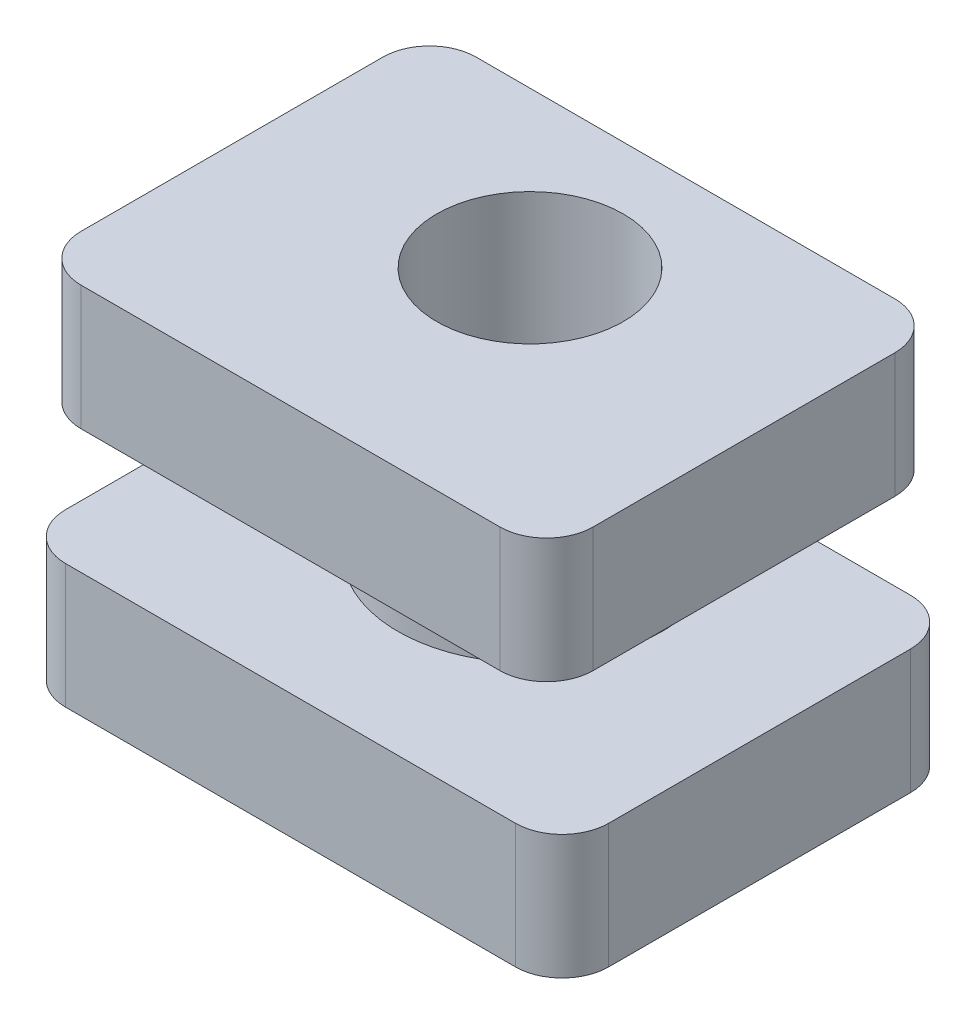
ISO-10303-21;
HEADER;
FILE_DESCRIPTION(('STEP AP214'),'2;1');
FILE_NAME('part.step','',(''),(''),'','','');
FILE_SCHEMA(('AUTOMOTIVE_DESIGN { 1 0 10303 214 1 1 1 1 }'));
ENDSEC;
DATA;
#1=APPLICATION_CONTEXT('core data for automotive mechanical design processes');
#2=APPLICATION_PROTOCOL_DEFINITION('international standard','automotive_design',2000,#1);
#3=PRODUCT_CONTEXT('',#1,'mechanical');
#4=PRODUCT('Part','Part','',(#3));
#5=PRODUCT_RELATED_PRODUCT_CATEGORY('part','',(#4));
#6=PRODUCT_DEFINITION_FORMATION('','',#4);
#7=PRODUCT_DEFINITION_CONTEXT('part definition',#1,'design');
#8=PRODUCT_DEFINITION('design','',#6,#7);
#9=PRODUCT_DEFINITION_SHAPE('','',#8);
#10=(LENGTH_UNIT() NAMED_UNIT(*) SI_UNIT(.MILLI.,.METRE.));
#11=(NAMED_UNIT(*) PLANE_ANGLE_UNIT() SI_UNIT($,.RADIAN.));
#12=(NAMED_UNIT(*) SI_UNIT($,.STERADIAN.) SOLID_ANGLE_UNIT());
#13=UNCERTAINTY_MEASURE_WITH_UNIT(LENGTH_MEASURE(1.E-05),#10,'distance_accuracy_value','');
#14=(GEOMETRIC_REPRESENTATION_CONTEXT(3) GLOBAL_UNCERTAINTY_ASSIGNED_CONTEXT((#13)) GLOBAL_UNIT_ASSIGNED_CONTEXT((#10,
#11,#12)) REPRESENTATION_CONTEXT('',''));
#15=CARTESIAN_POINT('',(0.,0.,0.));
#16=DIRECTION('',(0.,0.,1.));
#17=DIRECTION('',(1.,0.,0.));
#18=AXIS2_PLACEMENT_3D('',#15,#16,#17);
#19=CARTESIAN_POINT('',(-3.61562396,2.00000108,-2.42499896));
#20=DIRECTION('',(0.,1.,0.));
#21=DIRECTION('',(0.,0.,1.));
#22=AXIS2_PLACEMENT_3D('',#19,#20,#21);
#23=PLANE('',#22);
#24=CARTESIAN_POINT('',(0.,2.00000108,-0.674999919999999));
#25=DIRECTION('',(0.,1.,0.));
#26=DIRECTION('',(0.,0.,1.));
#27=AXIS2_PLACEMENT_3D('',#24,#25,#26);
#28=CIRCLE('',#27,2.12499956);
#29=CARTESIAN_POINT('',(-1.50000081,2.00000108,-2.18019781396595));
#30=VERTEX_POINT('',#29);
#31=CARTESIAN_POINT('',(1.50000081,2.00000108,-2.18019781396595));
#32=VERTEX_POINT('',#31);
#33=EDGE_CURVE('E51',#30,#32,#28,.T.);
#34=ORIENTED_EDGE('',*,*,#33,.F.);
#35=DIRECTION('',(0.,0.,-1.));
#36=VECTOR('',#35,1.);
#37=CARTESIAN_POINT('',(-1.50000081,2.00000108,0.));
#38=LINE('',#37,#36);
#39=CARTESIAN_POINT('',(-1.50000081,2.00000108,-3.175));
#40=VERTEX_POINT('',#39);
#41=EDGE_CURVE('E345',#30,#40,#38,.T.);
#42=ORIENTED_EDGE('',*,*,#41,.T.);
#43=DIRECTION('',(-1.,0.,0.));
#44=VECTOR('',#43,1.);
#45=CARTESIAN_POINT('',(-3.61562396,2.00000108,-3.175));
#46=LINE('',#45,#44);
#47=CARTESIAN_POINT('',(-3.61562396,2.00000108,-3.175));
#48=VERTEX_POINT('',#47);
#49=EDGE_CURVE('E340',#40,#48,#46,.T.);
#50=ORIENTED_EDGE('',*,*,#49,.T.);
#51=CARTESIAN_POINT('',(-3.61562396,2.00000108,-2.42499896));
#52=DIRECTION('',(0.,1.,0.));
#53=DIRECTION('',(0.,0.,1.));
#54=AXIS2_PLACEMENT_3D('',#51,#52,#53);
#55=CIRCLE('',#54,0.75000104);
#56=CARTESIAN_POINT('',(-4.365625,2.00000108,-2.42499895999999));
#57=VERTEX_POINT('',#56);
#58=EDGE_CURVE('E318',#48,#57,#55,.T.);
#59=ORIENTED_EDGE('',*,*,#58,.T.);
#60=DIRECTION('',(0.,0.,1.));
#61=VECTOR('',#60,1.);
#62=CARTESIAN_POINT('',(-4.365625,2.00000108,2.42499896));
#63=LINE('',#62,#61);
#64=CARTESIAN_POINT('',(-4.365625,2.00000108,2.42499896));
#65=VERTEX_POINT('',#64);
#66=EDGE_CURVE('E355',#57,#65,#63,.T.);
#67=ORIENTED_EDGE('',*,*,#66,.T.);
#68=CARTESIAN_POINT('',(-3.61562396,2.00000108,2.42499896));
#69=DIRECTION('',(0.,1.,0.));
#70=DIRECTION('',(0.,0.,1.));
#71=AXIS2_PLACEMENT_3D('',#68,#69,#70);
#72=CIRCLE('',#71,0.75000104);
#73=CARTESIAN_POINT('',(-3.61562396,2.00000108,3.175));
#74=VERTEX_POINT('',#73);
#75=EDGE_CURVE('E357',#65,#74,#72,.T.);
#76=ORIENTED_EDGE('',*,*,#75,.T.);
#77=DIRECTION('',(1.,0.,0.));
#78=VECTOR('',#77,1.);
#79=CARTESIAN_POINT('',(-3.61562396,2.00000108,3.175));
#80=LINE('',#79,#78);
#81=CARTESIAN_POINT('',(3.61562395999999,2.00000108,3.175));
#82=VERTEX_POINT('',#81);
#83=EDGE_CURVE('E359',#74,#82,#80,.T.);
#84=ORIENTED_EDGE('',*,*,#83,.T.);
#85=CARTESIAN_POINT('',(3.61562396,2.00000108,2.42499896));
#86=DIRECTION('',(0.,1.,0.));
#87=DIRECTION('',(0.,0.,1.));
#88=AXIS2_PLACEMENT_3D('',#85,#86,#87);
#89=CIRCLE('',#88,0.75000104);
#90=CARTESIAN_POINT('',(4.365625,2.00000108,2.42499896));
#91=VERTEX_POINT('',#90);
#92=EDGE_CURVE('E361',#82,#91,#89,.T.);
#93=ORIENTED_EDGE('',*,*,#92,.T.);
#94=DIRECTION('',(0.,0.,-1.));
#95=VECTOR('',#94,1.);
#96=CARTESIAN_POINT('',(4.365625,2.00000108,2.42499896));
#97=LINE('',#96,#95);
#98=CARTESIAN_POINT('',(4.365625,2.00000108,-2.42499895999999));
#99=VERTEX_POINT('',#98);
#100=EDGE_CURVE('E363',#91,#99,#97,.T.);
#101=ORIENTED_EDGE('',*,*,#100,.T.);
#102=CARTESIAN_POINT('',(3.61562396,2.00000108,-2.42499896));
#103=DIRECTION('',(0.,1.,0.));
#104=DIRECTION('',(0.,0.,1.));
#105=AXIS2_PLACEMENT_3D('',#102,#103,#104);
#106=CIRCLE('',#105,0.75000104);
#107=CARTESIAN_POINT('',(3.61562395999999,2.00000108,-3.175));
#108=VERTEX_POINT('',#107);
#109=EDGE_CURVE('E342',#99,#108,#106,.T.);
#110=ORIENTED_EDGE('',*,*,#109,.T.);
#111=CARTESIAN_POINT('',(1.50000081,2.00000108,-3.175));
#112=VERTEX_POINT('',#111);
#113=EDGE_CURVE('E322',#108,#112,#46,.T.);
#114=ORIENTED_EDGE('',*,*,#113,.T.);
#115=DIRECTION('',(0.,0.,-1.));
#116=VECTOR('',#115,1.);
#117=CARTESIAN_POINT('',(1.50000081,2.00000108,0.));
#118=LINE('',#117,#116);
#119=EDGE_CURVE('E56',#32,#112,#118,.T.);
#120=ORIENTED_EDGE('',*,*,#119,.F.);
#121=EDGE_LOOP('',(#34,#42,#50,#59,#67,#76,#84,#93,#101,#110,#114,#120));
#122=FACE_BOUND('',#121,.T.);
#123=ADVANCED_FACE('F34',(#122),#23,.T.);
#124=CARTESIAN_POINT('',(-3.61562396,2.00000108,-2.42499896));
#125=DIRECTION('',(0.,-1.,0.));
#126=DIRECTION('',(0.,0.,-1.));
#127=AXIS2_PLACEMENT_3D('',#124,#125,#126);
#128=CYLINDRICAL_SURFACE('',#127,0.75000104);
#129=CARTESIAN_POINT('',(-3.61562396,0.,-2.42499896));
#130=DIRECTION('',(0.,1.,0.));
#131=DIRECTION('',(0.,0.,1.));
#132=AXIS2_PLACEMENT_3D('',#129,#130,#131);
#133=CIRCLE('',#132,0.75000104);
#134=CARTESIAN_POINT('',(-3.61562396,0.,-3.175));
#135=VERTEX_POINT('',#134);
#136=CARTESIAN_POINT('',(-4.365625,0.,-2.42499895999999));
#137=VERTEX_POINT('',#136);
#138=EDGE_CURVE('E290',#135,#137,#133,.T.);
#139=ORIENTED_EDGE('',*,*,#138,.T.);
#140=DIRECTION('',(0.,-1.,0.));
#141=VECTOR('',#140,1.);
#142=CARTESIAN_POINT('',(-4.365625,2.00000108,-2.42499895999999));
#143=LINE('',#142,#141);
#144=EDGE_CURVE('E11',#57,#137,#143,.T.);
#145=ORIENTED_EDGE('',*,*,#144,.F.);
#146=ORIENTED_EDGE('',*,*,#58,.F.);
#147=DIRECTION('',(0.,-1.,0.));
#148=VECTOR('',#147,1.);
#149=CARTESIAN_POINT('',(-3.61562396,2.00000108,-3.175));
#150=LINE('',#149,#148);
#151=EDGE_CURVE('E319',#48,#135,#150,.T.);
#152=ORIENTED_EDGE('',*,*,#151,.T.);
#153=EDGE_LOOP('',(#139,#145,#146,#152));
#154=FACE_BOUND('',#153,.T.);
#155=ADVANCED_FACE('F36',(#154),#128,.T.);
#156=CARTESIAN_POINT('',(-4.365625,2.00000108,2.42499896));
#157=DIRECTION('',(1.,0.,0.));
#158=DIRECTION('',(0.,0.,-1.));
#159=AXIS2_PLACEMENT_3D('',#156,#157,#158);
#160=PLANE('',#159);
#161=DIRECTION('',(0.,0.,1.));
#162=VECTOR('',#161,1.);
#163=CARTESIAN_POINT('',(-4.365625,0.,2.42499896));
#164=LINE('',#163,#162);
#165=CARTESIAN_POINT('',(-4.365625,0.,2.42499896));
#166=VERTEX_POINT('',#165);
#167=EDGE_CURVE('E294',#137,#166,#164,.T.);
#168=ORIENTED_EDGE('',*,*,#167,.T.);
#169=DIRECTION('',(0.,-1.,0.));
#170=VECTOR('',#169,1.);
#171=CARTESIAN_POINT('',(-4.365625,2.00000108,2.42499896));
#172=LINE('',#171,#170);
#173=EDGE_CURVE('E43',#65,#166,#172,.T.);
#174=ORIENTED_EDGE('',*,*,#173,.F.);
#175=ORIENTED_EDGE('',*,*,#66,.F.);
#176=ORIENTED_EDGE('',*,*,#144,.T.);
#177=EDGE_LOOP('',(#168,#174,#175,#176));
#178=FACE_BOUND('',#177,.T.);
#179=ADVANCED_FACE('F397',(#178),#160,.F.);
#180=CARTESIAN_POINT('',(-3.61562396,2.00000108,2.42499896));
#181=DIRECTION('',(0.,-1.,0.));
#182=DIRECTION('',(0.,0.,-1.));
#183=AXIS2_PLACEMENT_3D('',#180,#181,#182);
#184=CYLINDRICAL_SURFACE('',#183,0.75000104);
#185=CARTESIAN_POINT('',(-3.61562396,0.,2.42499896));
#186=DIRECTION('',(0.,1.,0.));
#187=DIRECTION('',(0.,0.,1.));
#188=AXIS2_PLACEMENT_3D('',#185,#186,#187);
#189=CIRCLE('',#188,0.75000104);
#190=CARTESIAN_POINT('',(-3.61562396,0.,3.175));
#191=VERTEX_POINT('',#190);
#192=EDGE_CURVE('E300',#166,#191,#189,.T.);
#193=ORIENTED_EDGE('',*,*,#192,.T.);
#194=DIRECTION('',(0.,-1.,0.));
#195=VECTOR('',#194,1.);
#196=CARTESIAN_POINT('',(-3.61562396,2.00000108,3.175));
#197=LINE('',#196,#195);
#198=EDGE_CURVE('E334',#74,#191,#197,.T.);
#199=ORIENTED_EDGE('',*,*,#198,.F.);
#200=ORIENTED_EDGE('',*,*,#75,.F.);
#201=ORIENTED_EDGE('',*,*,#173,.T.);
#202=EDGE_LOOP('',(#193,#199,#200,#201));
#203=FACE_BOUND('',#202,.T.);
#204=ADVANCED_FACE('F399',(#203),#184,.T.);
#205=CARTESIAN_POINT('',(-3.61562396,2.00000108,3.175));
#206=DIRECTION('',(0.,0.,-1.));
#207=DIRECTION('',(-1.,0.,0.));
#208=AXIS2_PLACEMENT_3D('',#205,#206,#207);
#209=PLANE('',#208);
#210=DIRECTION('',(1.,0.,0.));
#211=VECTOR('',#210,1.);
#212=CARTESIAN_POINT('',(-3.61562396,0.,3.175));
#213=LINE('',#212,#211);
#214=CARTESIAN_POINT('',(3.61562395999999,0.,3.175));
#215=VERTEX_POINT('',#214);
#216=EDGE_CURVE('E309',#191,#215,#213,.T.);
#217=ORIENTED_EDGE('',*,*,#216,.T.);
#218=DIRECTION('',(0.,-1.,0.));
#219=VECTOR('',#218,1.);
#220=CARTESIAN_POINT('',(3.61562395999999,2.00000108,3.175));
#221=LINE('',#220,#219);
#222=EDGE_CURVE('E331',#82,#215,#221,.T.);
#223=ORIENTED_EDGE('',*,*,#222,.F.);
#224=ORIENTED_EDGE('',*,*,#83,.F.);
#225=ORIENTED_EDGE('',*,*,#198,.T.);
#226=EDGE_LOOP('',(#217,#223,#224,#225));
#227=FACE_BOUND('',#226,.T.);
#228=ADVANCED_FACE('F404',(#227),#209,.F.);
#229=CARTESIAN_POINT('',(3.61562396,2.00000108,2.42499896));
#230=DIRECTION('',(0.,-1.,0.));
#231=DIRECTION('',(0.,0.,-1.));
#232=AXIS2_PLACEMENT_3D('',#229,#230,#231);
#233=CYLINDRICAL_SURFACE('',#232,0.75000104);
#234=CARTESIAN_POINT('',(3.61562396,0.,2.42499896));
#235=DIRECTION('',(0.,1.,0.));
#236=DIRECTION('',(0.,0.,1.));
#237=AXIS2_PLACEMENT_3D('',#234,#235,#236);
#238=CIRCLE('',#237,0.75000104);
#239=CARTESIAN_POINT('',(4.365625,0.,2.42499896));
#240=VERTEX_POINT('',#239);
#241=EDGE_CURVE('E311',#215,#240,#238,.T.);
#242=ORIENTED_EDGE('',*,*,#241,.T.);
#243=DIRECTION('',(0.,-1.,0.));
#244=VECTOR('',#243,1.);
#245=CARTESIAN_POINT('',(4.365625,2.00000108,2.42499896));
#246=LINE('',#245,#244);
#247=EDGE_CURVE('E328',#91,#240,#246,.T.);
#248=ORIENTED_EDGE('',*,*,#247,.F.);
#249=ORIENTED_EDGE('',*,*,#92,.F.);
#250=ORIENTED_EDGE('',*,*,#222,.T.);
#251=EDGE_LOOP('',(#242,#248,#249,#250));
#252=FACE_BOUND('',#251,.T.);
#253=ADVANCED_FACE('F408',(#252),#233,.T.);
#254=CARTESIAN_POINT('',(4.365625,2.00000108,2.42499896));
#255=DIRECTION('',(-1.,0.,0.));
#256=DIRECTION('',(0.,0.,1.));
#257=AXIS2_PLACEMENT_3D('',#254,#255,#256);
#258=PLANE('',#257);
#259=DIRECTION('',(0.,0.,-1.));
#260=VECTOR('',#259,1.);
#261=CARTESIAN_POINT('',(4.365625,0.,2.42499896));
#262=LINE('',#261,#260);
#263=CARTESIAN_POINT('',(4.365625,0.,-2.42499895999999));
#264=VERTEX_POINT('',#263);
#265=EDGE_CURVE('E313',#240,#264,#262,.T.);
#266=ORIENTED_EDGE('',*,*,#265,.T.);
#267=DIRECTION('',(0.,-1.,0.));
#268=VECTOR('',#267,1.);
#269=CARTESIAN_POINT('',(4.365625,2.00000108,-2.42499895999999));
#270=LINE('',#269,#268);
#271=EDGE_CURVE('E325',#99,#264,#270,.T.);
#272=ORIENTED_EDGE('',*,*,#271,.F.);
#273=ORIENTED_EDGE('',*,*,#100,.F.);
#274=ORIENTED_EDGE('',*,*,#247,.T.);
#275=EDGE_LOOP('',(#266,#272,#273,#274));
#276=FACE_BOUND('',#275,.T.);
#277=ADVANCED_FACE('F412',(#276),#258,.F.);
#278=CARTESIAN_POINT('',(3.61562396,2.00000108,-2.42499896));
#279=DIRECTION('',(0.,-1.,0.));
#280=DIRECTION('',(0.,0.,-1.));
#281=AXIS2_PLACEMENT_3D('',#278,#279,#280);
#282=CYLINDRICAL_SURFACE('',#281,0.75000104);
#283=CARTESIAN_POINT('',(3.61562396,0.,-2.42499896));
#284=DIRECTION('',(0.,1.,0.));
#285=DIRECTION('',(0.,0.,1.));
#286=AXIS2_PLACEMENT_3D('',#283,#284,#285);
#287=CIRCLE('',#286,0.75000104);
#288=CARTESIAN_POINT('',(3.61562395999999,0.,-3.175));
#289=VERTEX_POINT('',#288);
#290=EDGE_CURVE('E315',#264,#289,#287,.T.);
#291=ORIENTED_EDGE('',*,*,#290,.T.);
#292=DIRECTION('',(0.,-1.,0.));
#293=VECTOR('',#292,1.);
#294=CARTESIAN_POINT('',(3.61562395999999,2.00000108,-3.175));
#295=LINE('',#294,#293);
#296=EDGE_CURVE('E321',#108,#289,#295,.T.);
#297=ORIENTED_EDGE('',*,*,#296,.F.);
#298=ORIENTED_EDGE('',*,*,#109,.F.);
#299=ORIENTED_EDGE('',*,*,#271,.T.);
#300=EDGE_LOOP('',(#291,#297,#298,#299));
#301=FACE_BOUND('',#300,.T.);
#302=ADVANCED_FACE('F370',(#301),#282,.T.);
#303=CARTESIAN_POINT('',(-3.61562396,2.00000108,-3.175));
#304=DIRECTION('',(0.,0.,1.));
#305=DIRECTION('',(1.,0.,0.));
#306=AXIS2_PLACEMENT_3D('',#303,#304,#305);
#307=PLANE('',#306);
#308=DIRECTION('',(-1.,0.,0.));
#309=VECTOR('',#308,1.);
#310=CARTESIAN_POINT('',(-3.61562396,0.,-3.175));
#311=LINE('',#310,#309);
#312=EDGE_CURVE('E292',#289,#135,#311,.T.);
#313=ORIENTED_EDGE('',*,*,#312,.T.);
#314=ORIENTED_EDGE('',*,*,#151,.F.);
#315=ORIENTED_EDGE('',*,*,#49,.F.);
#316=DIRECTION('',(0.,-1.,0.));
#317=VECTOR('',#316,1.);
#318=CARTESIAN_POINT('',(-1.50000081,4.00000216,-3.175));
#319=LINE('',#318,#317);
#320=CARTESIAN_POINT('',(-1.50000081,4.00000216,-3.175));
#321=VERTEX_POINT('',#320);
#322=EDGE_CURVE('E260',#321,#40,#319,.T.);
#323=ORIENTED_EDGE('',*,*,#322,.F.);
#324=DIRECTION('',(-1.,0.,0.));
#325=VECTOR('',#324,1.);
#326=CARTESIAN_POINT('',(3.365623952,4.00000216,-3.175));
#327=LINE('',#326,#325);
#328=CARTESIAN_POINT('',(-3.365623952,4.00000216,-3.175));
#329=VERTEX_POINT('',#328);
#330=EDGE_CURVE('E206',#321,#329,#327,.T.);
#331=ORIENTED_EDGE('',*,*,#330,.T.);
#332=DIRECTION('',(0.,-1.,0.));
#333=VECTOR('',#332,1.);
#334=CARTESIAN_POINT('',(-3.365623952,6.00000324,-3.175));
#335=LINE('',#334,#333);
#336=CARTESIAN_POINT('',(-3.365623952,6.00000324,-3.175));
#337=VERTEX_POINT('',#336);
#338=EDGE_CURVE('E213',#337,#329,#335,.T.);
#339=ORIENTED_EDGE('',*,*,#338,.F.);
#340=DIRECTION('',(-1.,0.,0.));
#341=VECTOR('',#340,1.);
#342=CARTESIAN_POINT('',(3.365623952,6.00000324,-3.175));
#343=LINE('',#342,#341);
#344=CARTESIAN_POINT('',(3.365623952,6.00000324,-3.175));
#345=VERTEX_POINT('',#344);
#346=EDGE_CURVE('E188',#345,#337,#343,.T.);
#347=ORIENTED_EDGE('',*,*,#346,.F.);
#348=DIRECTION('',(0.,-1.,0.));
#349=VECTOR('',#348,1.);
#350=CARTESIAN_POINT('',(3.365623952,6.00000324,-3.175));
#351=LINE('',#350,#349);
#352=CARTESIAN_POINT('',(3.365623952,4.00000216,-3.175));
#353=VERTEX_POINT('',#352);
#354=EDGE_CURVE('E216',#345,#353,#351,.T.);
#355=ORIENTED_EDGE('',*,*,#354,.T.);
#356=CARTESIAN_POINT('',(1.50000081,4.00000216,-3.175));
#357=VERTEX_POINT('',#356);
#358=EDGE_CURVE('E192',#353,#357,#327,.T.);
#359=ORIENTED_EDGE('',*,*,#358,.T.);
#360=DIRECTION('',(0.,-1.,0.));
#361=VECTOR('',#360,1.);
#362=CARTESIAN_POINT('',(1.50000081,4.00000216,-3.175));
#363=LINE('',#362,#361);
#364=EDGE_CURVE('E302',#357,#112,#363,.T.);
#365=ORIENTED_EDGE('',*,*,#364,.T.);
#366=ORIENTED_EDGE('',*,*,#113,.F.);
#367=ORIENTED_EDGE('',*,*,#296,.T.);
#368=EDGE_LOOP('',(#313,#314,#315,#323,#331,#339,#347,#355,#359,#365,#366,#367));
#369=FACE_BOUND('',#368,.T.);
#370=ADVANCED_FACE('F257',(#369),#307,.F.);
#371=CARTESIAN_POINT('',(-3.61562396,0.,-2.42499896));
#372=DIRECTION('',(0.,1.,0.));
#373=DIRECTION('',(0.,0.,1.));
#374=AXIS2_PLACEMENT_3D('',#371,#372,#373);
#375=PLANE('',#374);
#376=CARTESIAN_POINT('',(0.,0.,-0.674999919999999));
#377=DIRECTION('',(0.,-1.,0.));
#378=DIRECTION('',(0.,0.,-1.));
#379=AXIS2_PLACEMENT_3D('',#376,#377,#378);
#380=CIRCLE('',#379,1.499997);
#381=CARTESIAN_POINT('',(0.,0.,-2.17499692));
#382=VERTEX_POINT('',#381);
#383=EDGE_CURVE('E265',#382,#382,#380,.T.);
#384=ORIENTED_EDGE('',*,*,#383,.F.);
#385=EDGE_LOOP('',(#384));
#386=FACE_BOUND('',#385,.T.);
#387=ORIENTED_EDGE('',*,*,#138,.F.);
#388=ORIENTED_EDGE('',*,*,#312,.F.);
#389=ORIENTED_EDGE('',*,*,#290,.F.);
#390=ORIENTED_EDGE('',*,*,#265,.F.);
#391=ORIENTED_EDGE('',*,*,#241,.F.);
#392=ORIENTED_EDGE('',*,*,#216,.F.);
#393=ORIENTED_EDGE('',*,*,#192,.F.);
#394=ORIENTED_EDGE('',*,*,#167,.F.);
#395=EDGE_LOOP('',(#387,#388,#389,#390,#391,#392,#393,#394));
#396=FACE_BOUND('',#395,.T.);
#397=ADVANCED_FACE('F282',(#386,#396),#375,.F.);
#398=CARTESIAN_POINT('',(0.,4.00000216,-0.674999919999999));
#399=DIRECTION('',(0.,-1.,0.));
#400=DIRECTION('',(0.,0.,-1.));
#401=AXIS2_PLACEMENT_3D('',#398,#399,#400);
#402=CYLINDRICAL_SURFACE('',#401,2.12499956);
#403=ORIENTED_EDGE('',*,*,#33,.T.);
#404=DIRECTION('',(0.,-1.,0.));
#405=VECTOR('',#404,1.);
#406=CARTESIAN_POINT('',(1.50000081,4.00000216,-2.18019781396595));
#407=LINE('',#406,#405);
#408=CARTESIAN_POINT('',(1.50000081,4.00000216,-2.18019781396595));
#409=VERTEX_POINT('',#408);
#410=EDGE_CURVE('E298',#409,#32,#407,.T.);
#411=ORIENTED_EDGE('',*,*,#410,.F.);
#412=CARTESIAN_POINT('',(0.,4.00000216,-0.674999919999999));
#413=DIRECTION('',(0.,1.,0.));
#414=DIRECTION('',(0.,0.,1.));
#415=AXIS2_PLACEMENT_3D('',#412,#413,#414);
#416=CIRCLE('',#415,2.12499956);
#417=CARTESIAN_POINT('',(-1.50000081,4.00000216,-2.18019781396595));
#418=VERTEX_POINT('',#417);
#419=EDGE_CURVE('E387',#418,#409,#416,.T.);
#420=ORIENTED_EDGE('',*,*,#419,.F.);
#421=DIRECTION('',(0.,-1.,0.));
#422=VECTOR('',#421,1.);
#423=CARTESIAN_POINT('',(-1.50000081,4.00000216,-2.18019781396595));
#424=LINE('',#423,#422);
#425=EDGE_CURVE('E350',#418,#30,#424,.T.);
#426=ORIENTED_EDGE('',*,*,#425,.T.);
#427=EDGE_LOOP('',(#403,#411,#420,#426));
#428=FACE_BOUND('',#427,.T.);
#429=ADVANCED_FACE('F285',(#428),#402,.T.);
#430=CARTESIAN_POINT('',(1.50000081,4.00000216,0.));
#431=DIRECTION('',(-1.,0.,0.));
#432=DIRECTION('',(0.,0.,1.));
#433=AXIS2_PLACEMENT_3D('',#430,#431,#432);
#434=PLANE('',#433);
#435=ORIENTED_EDGE('',*,*,#119,.T.);
#436=ORIENTED_EDGE('',*,*,#364,.F.);
#437=DIRECTION('',(0.,0.,-1.));
#438=VECTOR('',#437,1.);
#439=CARTESIAN_POINT('',(1.50000081,4.00000216,0.));
#440=LINE('',#439,#438);
#441=EDGE_CURVE('E385',#409,#357,#440,.T.);
#442=ORIENTED_EDGE('',*,*,#441,.F.);
#443=ORIENTED_EDGE('',*,*,#410,.T.);
#444=EDGE_LOOP('',(#435,#436,#442,#443));
#445=FACE_BOUND('',#444,.T.);
#446=ADVANCED_FACE('F446',(#445),#434,.F.);
#447=CARTESIAN_POINT('',(-1.50000081,4.00000216,0.));
#448=DIRECTION('',(-1.,0.,0.));
#449=DIRECTION('',(0.,0.,1.));
#450=AXIS2_PLACEMENT_3D('',#447,#448,#449);
#451=PLANE('',#450);
#452=ORIENTED_EDGE('',*,*,#41,.F.);
#453=ORIENTED_EDGE('',*,*,#425,.F.);
#454=DIRECTION('',(0.,0.,-1.));
#455=VECTOR('',#454,1.);
#456=CARTESIAN_POINT('',(-1.50000081,4.00000216,0.));
#457=LINE('',#456,#455);
#458=EDGE_CURVE('E351',#418,#321,#457,.T.);
#459=ORIENTED_EDGE('',*,*,#458,.T.);
#460=ORIENTED_EDGE('',*,*,#322,.T.);
#461=EDGE_LOOP('',(#452,#453,#459,#460));
#462=FACE_BOUND('',#461,.T.);
#463=ADVANCED_FACE('F453',(#462),#451,.T.);
#464=CARTESIAN_POINT('',(-3.365623952,4.00000216,-2.42499896));
#465=DIRECTION('',(0.,1.,0.));
#466=DIRECTION('',(0.,0.,1.));
#467=AXIS2_PLACEMENT_3D('',#464,#465,#466);
#468=PLANE('',#467);
#469=ORIENTED_EDGE('',*,*,#419,.T.);
#470=ORIENTED_EDGE('',*,*,#441,.T.);
#471=ORIENTED_EDGE('',*,*,#358,.F.);
#472=CARTESIAN_POINT('',(3.365623952,4.00000216,-2.42499896));
#473=DIRECTION('',(0.,1.,0.));
#474=DIRECTION('',(0.,0.,-1.));
#475=AXIS2_PLACEMENT_3D('',#472,#473,#474);
#476=CIRCLE('',#475,0.750001039999999);
#477=CARTESIAN_POINT('',(4.115624992,4.00000216,-2.42499895999999));
#478=VERTEX_POINT('',#477);
#479=EDGE_CURVE('E211',#478,#353,#476,.T.);
#480=ORIENTED_EDGE('',*,*,#479,.F.);
#481=DIRECTION('',(0.,0.,-1.));
#482=VECTOR('',#481,1.);
#483=CARTESIAN_POINT('',(4.115624992,4.00000216,2.42499896));
#484=LINE('',#483,#482);
#485=CARTESIAN_POINT('',(4.115624992,4.00000216,2.42499896));
#486=VERTEX_POINT('',#485);
#487=EDGE_CURVE('E245',#486,#478,#484,.T.);
#488=ORIENTED_EDGE('',*,*,#487,.F.);
#489=CARTESIAN_POINT('',(3.365623952,4.00000216,2.42499896));
#490=DIRECTION('',(0.,1.,0.));
#491=DIRECTION('',(0.,0.,1.));
#492=AXIS2_PLACEMENT_3D('',#489,#490,#491);
#493=CIRCLE('',#492,0.750001039999999);
#494=CARTESIAN_POINT('',(3.365623952,4.00000216,3.175));
#495=VERTEX_POINT('',#494);
#496=EDGE_CURVE('E243',#495,#486,#493,.T.);
#497=ORIENTED_EDGE('',*,*,#496,.F.);
#498=DIRECTION('',(1.,0.,0.));
#499=VECTOR('',#498,1.);
#500=CARTESIAN_POINT('',(-3.365623952,4.00000216,3.175));
#501=LINE('',#500,#499);
#502=CARTESIAN_POINT('',(-3.365623952,4.00000216,3.175));
#503=VERTEX_POINT('',#502);
#504=EDGE_CURVE('E234',#503,#495,#501,.T.);
#505=ORIENTED_EDGE('',*,*,#504,.F.);
#506=CARTESIAN_POINT('',(-3.365623952,4.00000216,2.42499896));
#507=DIRECTION('',(0.,1.,0.));
#508=DIRECTION('',(0.,0.,-1.));
#509=AXIS2_PLACEMENT_3D('',#506,#507,#508);
#510=CIRCLE('',#509,0.75000104);
#511=CARTESIAN_POINT('',(-4.115624992,4.00000216,2.42499896));
#512=VERTEX_POINT('',#511);
#513=EDGE_CURVE('E241',#512,#503,#510,.T.);
#514=ORIENTED_EDGE('',*,*,#513,.F.);
#515=DIRECTION('',(0.,0.,1.));
#516=VECTOR('',#515,1.);
#517=CARTESIAN_POINT('',(-4.115624992,4.00000216,-2.42499895999999));
#518=LINE('',#517,#516);
#519=CARTESIAN_POINT('',(-4.115624992,4.00000216,-2.42499895999999));
#520=VERTEX_POINT('',#519);
#521=EDGE_CURVE('E247',#520,#512,#518,.T.);
#522=ORIENTED_EDGE('',*,*,#521,.F.);
#523=CARTESIAN_POINT('',(-3.365623952,4.00000216,-2.42499896));
#524=DIRECTION('',(0.,1.,0.));
#525=DIRECTION('',(0.,0.,1.));
#526=AXIS2_PLACEMENT_3D('',#523,#524,#525);
#527=CIRCLE('',#526,0.75000104);
#528=EDGE_CURVE('E196',#329,#520,#527,.T.);
#529=ORIENTED_EDGE('',*,*,#528,.F.);
#530=ORIENTED_EDGE('',*,*,#330,.F.);
#531=ORIENTED_EDGE('',*,*,#458,.F.);
#532=EDGE_LOOP('',(#469,#470,#471,#480,#488,#497,#505,#514,#522,#529,#530,#531));
#533=FACE_BOUND('',#532,.T.);
#534=ADVANCED_FACE('F240',(#533),#468,.F.);
#535=CARTESIAN_POINT('',(-3.365623952,6.00000324,-2.42499896));
#536=DIRECTION('',(0.,-1.,0.));
#537=DIRECTION('',(0.,0.,-1.));
#538=AXIS2_PLACEMENT_3D('',#535,#536,#537);
#539=CYLINDRICAL_SURFACE('',#538,0.75000104);
#540=ORIENTED_EDGE('',*,*,#528,.T.);
#541=DIRECTION('',(0.,-1.,0.));
#542=VECTOR('',#541,1.);
#543=CARTESIAN_POINT('',(-4.115624992,6.00000324,-2.42499895999999));
#544=LINE('',#543,#542);
#545=CARTESIAN_POINT('',(-4.115624992,6.00000324,-2.42499895999999));
#546=VERTEX_POINT('',#545);
#547=EDGE_CURVE('E176',#546,#520,#544,.T.);
#548=ORIENTED_EDGE('',*,*,#547,.F.);
#549=CARTESIAN_POINT('',(-3.365623952,6.00000324,-2.42499896));
#550=DIRECTION('',(0.,1.,0.));
#551=DIRECTION('',(0.,0.,1.));
#552=AXIS2_PLACEMENT_3D('',#549,#550,#551);
#553=CIRCLE('',#552,0.75000104);
#554=EDGE_CURVE('E183',#337,#546,#553,.T.);
#555=ORIENTED_EDGE('',*,*,#554,.F.);
#556=ORIENTED_EDGE('',*,*,#338,.T.);
#557=EDGE_LOOP('',(#540,#548,#555,#556));
#558=FACE_BOUND('',#557,.T.);
#559=ADVANCED_FACE('F194',(#558),#539,.T.);
#560=CARTESIAN_POINT('',(-4.115624992,6.00000324,-2.42499895999999));
#561=DIRECTION('',(1.,0.,0.));
#562=DIRECTION('',(0.,0.,-1.));
#563=AXIS2_PLACEMENT_3D('',#560,#561,#562);
#564=PLANE('',#563);
#565=ORIENTED_EDGE('',*,*,#521,.T.);
#566=DIRECTION('',(0.,-1.,0.));
#567=VECTOR('',#566,1.);
#568=CARTESIAN_POINT('',(-4.115624992,6.00000324,2.42499896));
#569=LINE('',#568,#567);
#570=CARTESIAN_POINT('',(-4.115624992,6.00000324,2.42499896));
#571=VERTEX_POINT('',#570);
#572=EDGE_CURVE('E179',#571,#512,#569,.T.);
#573=ORIENTED_EDGE('',*,*,#572,.F.);
#574=DIRECTION('',(0.,0.,1.));
#575=VECTOR('',#574,1.);
#576=CARTESIAN_POINT('',(-4.115624992,6.00000324,-2.42499895999999));
#577=LINE('',#576,#575);
#578=EDGE_CURVE('E172',#546,#571,#577,.T.);
#579=ORIENTED_EDGE('',*,*,#578,.F.);
#580=ORIENTED_EDGE('',*,*,#547,.T.);
#581=EDGE_LOOP('',(#565,#573,#579,#580));
#582=FACE_BOUND('',#581,.T.);
#583=ADVANCED_FACE('F174',(#582),#564,.F.);
#584=CARTESIAN_POINT('',(-3.365623952,6.00000324,2.42499896));
#585=DIRECTION('',(0.,-1.,0.));
#586=DIRECTION('',(0.,0.,-1.));
#587=AXIS2_PLACEMENT_3D('',#584,#585,#586);
#588=CYLINDRICAL_SURFACE('',#587,0.75000104);
#589=ORIENTED_EDGE('',*,*,#513,.T.);
#590=DIRECTION('',(0.,-1.,0.));
#591=VECTOR('',#590,1.);
#592=CARTESIAN_POINT('',(-3.365623952,6.00000324,3.175));
#593=LINE('',#592,#591);
#594=CARTESIAN_POINT('',(-3.365623952,6.00000324,3.175));
#595=VERTEX_POINT('',#594);
#596=EDGE_CURVE('E199',#595,#503,#593,.T.);
#597=ORIENTED_EDGE('',*,*,#596,.F.);
#598=CARTESIAN_POINT('',(-3.365623952,6.00000324,2.42499896));
#599=DIRECTION('',(0.,1.,0.));
#600=DIRECTION('',(0.,0.,-1.));
#601=AXIS2_PLACEMENT_3D('',#598,#599,#600);
#602=CIRCLE('',#601,0.75000104);
#603=EDGE_CURVE('E182',#571,#595,#602,.T.);
#604=ORIENTED_EDGE('',*,*,#603,.F.);
#605=ORIENTED_EDGE('',*,*,#572,.T.);
#606=EDGE_LOOP('',(#589,#597,#604,#605));
#607=FACE_BOUND('',#606,.T.);
#608=ADVANCED_FACE('F477',(#607),#588,.T.);
#609=CARTESIAN_POINT('',(-3.365623952,6.00000324,3.175));
#610=DIRECTION('',(0.,0.,-1.));
#611=DIRECTION('',(-1.,0.,0.));
#612=AXIS2_PLACEMENT_3D('',#609,#610,#611);
#613=PLANE('',#612);
#614=ORIENTED_EDGE('',*,*,#504,.T.);
#615=DIRECTION('',(0.,-1.,0.));
#616=VECTOR('',#615,1.);
#617=CARTESIAN_POINT('',(3.365623952,6.00000324,3.175));
#618=LINE('',#617,#616);
#619=CARTESIAN_POINT('',(3.365623952,6.00000324,3.175));
#620=VERTEX_POINT('',#619);
#621=EDGE_CURVE('E225',#620,#495,#618,.T.);
#622=ORIENTED_EDGE('',*,*,#621,.F.);
#623=DIRECTION('',(1.,0.,0.));
#624=VECTOR('',#623,1.);
#625=CARTESIAN_POINT('',(-3.365623952,6.00000324,3.175));
#626=LINE('',#625,#624);
#627=EDGE_CURVE('E235',#595,#620,#626,.T.);
#628=ORIENTED_EDGE('',*,*,#627,.F.);
#629=ORIENTED_EDGE('',*,*,#596,.T.);
#630=EDGE_LOOP('',(#614,#622,#628,#629));
#631=FACE_BOUND('',#630,.T.);
#632=ADVANCED_FACE('F232',(#631),#613,.F.);
#633=CARTESIAN_POINT('',(3.365623952,6.00000324,2.42499896));
#634=DIRECTION('',(0.,-1.,0.));
#635=DIRECTION('',(0.,0.,-1.));
#636=AXIS2_PLACEMENT_3D('',#633,#634,#635);
#637=CYLINDRICAL_SURFACE('',#636,0.750001039999999);
#638=ORIENTED_EDGE('',*,*,#496,.T.);
#639=DIRECTION('',(0.,-1.,0.));
#640=VECTOR('',#639,1.);
#641=CARTESIAN_POINT('',(4.115624992,6.00000324,2.42499896));
#642=LINE('',#641,#640);
#643=CARTESIAN_POINT('',(4.115624992,6.00000324,2.42499896));
#644=VERTEX_POINT('',#643);
#645=EDGE_CURVE('E222',#644,#486,#642,.T.);
#646=ORIENTED_EDGE('',*,*,#645,.F.);
#647=CARTESIAN_POINT('',(3.365623952,6.00000324,2.42499896));
#648=DIRECTION('',(0.,1.,0.));
#649=DIRECTION('',(0.,0.,1.));
#650=AXIS2_PLACEMENT_3D('',#647,#648,#649);
#651=CIRCLE('',#650,0.750001039999999);
#652=EDGE_CURVE('E273',#620,#644,#651,.T.);
#653=ORIENTED_EDGE('',*,*,#652,.F.);
#654=ORIENTED_EDGE('',*,*,#621,.T.);
#655=EDGE_LOOP('',(#638,#646,#653,#654));
#656=FACE_BOUND('',#655,.T.);
#657=ADVANCED_FACE('F490',(#656),#637,.T.);
#658=CARTESIAN_POINT('',(4.115624992,6.00000324,2.42499896));
#659=DIRECTION('',(-1.,0.,0.));
#660=DIRECTION('',(0.,0.,1.));
#661=AXIS2_PLACEMENT_3D('',#658,#659,#660);
#662=PLANE('',#661);
#663=ORIENTED_EDGE('',*,*,#487,.T.);
#664=DIRECTION('',(0.,-1.,0.));
#665=VECTOR('',#664,1.);
#666=CARTESIAN_POINT('',(4.115624992,6.00000324,-2.42499895999999));
#667=LINE('',#666,#665);
#668=CARTESIAN_POINT('',(4.115624992,6.00000324,-2.42499895999999));
#669=VERTEX_POINT('',#668);
#670=EDGE_CURVE('E219',#669,#478,#667,.T.);
#671=ORIENTED_EDGE('',*,*,#670,.F.);
#672=DIRECTION('',(0.,0.,-1.));
#673=VECTOR('',#672,1.);
#674=CARTESIAN_POINT('',(4.115624992,6.00000324,2.42499896));
#675=LINE('',#674,#673);
#676=EDGE_CURVE('E271',#644,#669,#675,.T.);
#677=ORIENTED_EDGE('',*,*,#676,.F.);
#678=ORIENTED_EDGE('',*,*,#645,.T.);
#679=EDGE_LOOP('',(#663,#671,#677,#678));
#680=FACE_BOUND('',#679,.T.);
#681=ADVANCED_FACE('F497',(#680),#662,.F.);
#682=CARTESIAN_POINT('',(3.365623952,6.00000324,-2.42499896));
#683=DIRECTION('',(0.,-1.,0.));
#684=DIRECTION('',(0.,0.,-1.));
#685=AXIS2_PLACEMENT_3D('',#682,#683,#684);
#686=CYLINDRICAL_SURFACE('',#685,0.750001039999999);
#687=ORIENTED_EDGE('',*,*,#479,.T.);
#688=ORIENTED_EDGE('',*,*,#354,.F.);
#689=CARTESIAN_POINT('',(3.365623952,6.00000324,-2.42499896));
#690=DIRECTION('',(0.,1.,0.));
#691=DIRECTION('',(0.,0.,-1.));
#692=AXIS2_PLACEMENT_3D('',#689,#690,#691);
#693=CIRCLE('',#692,0.750001039999999);
#694=EDGE_CURVE('E269',#669,#345,#693,.T.);
#695=ORIENTED_EDGE('',*,*,#694,.F.);
#696=ORIENTED_EDGE('',*,*,#670,.T.);
#697=EDGE_LOOP('',(#687,#688,#695,#696));
#698=FACE_BOUND('',#697,.T.);
#699=ADVANCED_FACE('F505',(#698),#686,.T.);
#700=CARTESIAN_POINT('',(-3.365623952,6.00000324,-2.42499896));
#701=DIRECTION('',(0.,1.,0.));
#702=DIRECTION('',(0.,0.,1.));
#703=AXIS2_PLACEMENT_3D('',#700,#701,#702);
#704=PLANE('',#703);
#705=CARTESIAN_POINT('',(0.,6.00000324,-0.674999919999999));
#706=DIRECTION('',(0.,-1.,0.));
#707=DIRECTION('',(0.,0.,-1.));
#708=AXIS2_PLACEMENT_3D('',#705,#706,#707);
#709=CIRCLE('',#708,1.499997);
#710=CARTESIAN_POINT('',(0.,6.00000324,-2.17499692));
#711=VERTEX_POINT('',#710);
#712=EDGE_CURVE('E262',#711,#711,#709,.T.);
#713=ORIENTED_EDGE('',*,*,#712,.T.);
#714=EDGE_LOOP('',(#713));
#715=FACE_BOUND('',#714,.T.);
#716=ORIENTED_EDGE('',*,*,#554,.T.);
#717=ORIENTED_EDGE('',*,*,#578,.T.);
#718=ORIENTED_EDGE('',*,*,#603,.T.);
#719=ORIENTED_EDGE('',*,*,#627,.T.);
#720=ORIENTED_EDGE('',*,*,#652,.T.);
#721=ORIENTED_EDGE('',*,*,#676,.T.);
#722=ORIENTED_EDGE('',*,*,#694,.T.);
#723=ORIENTED_EDGE('',*,*,#346,.T.);
#724=EDGE_LOOP('',(#716,#717,#718,#719,#720,#721,#722,#723));
#725=FACE_BOUND('',#724,.T.);
#726=ADVANCED_FACE('F186',(#715,#725),#704,.T.);
#727=CARTESIAN_POINT('',(0.,6.00000324,-0.674999919999999));
#728=DIRECTION('',(0.,-1.,0.));
#729=DIRECTION('',(0.,0.,-1.));
#730=AXIS2_PLACEMENT_3D('',#727,#728,#729);
#731=CYLINDRICAL_SURFACE('',#730,1.499997);
#732=ORIENTED_EDGE('',*,*,#712,.F.);
#733=EDGE_LOOP('',(#732));
#734=FACE_BOUND('',#733,.T.);
#735=ORIENTED_EDGE('',*,*,#383,.T.);
#736=EDGE_LOOP('',(#735));
#737=FACE_BOUND('',#736,.T.);
#738=ADVANCED_FACE('F280',(#734,#737),#731,.F.);
#739=CLOSED_SHELL('',(#123,#155,#179,#204,#228,#253,#277,#302,#370,#397,#429,#446,#463,#534,
#559,#583,#608,#632,#657,#681,#699,#726,#738));
#740=MANIFOLD_SOLID_BREP('B2',#739);
#741=ADVANCED_BREP_SHAPE_REPRESENTATION('',(#18,#740),#14);
#742=SHAPE_DEFINITION_REPRESENTATION(#9,#741);
ENDSEC;
END-ISO-10303-21;
